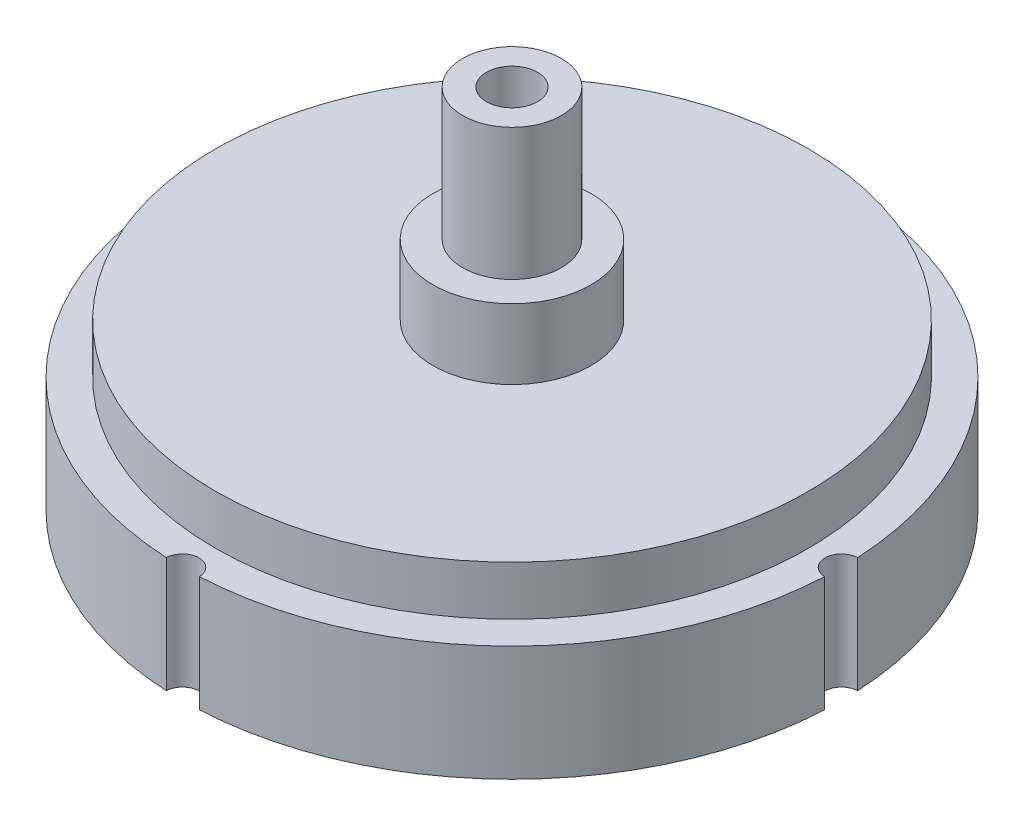
ISO-10303-21;
HEADER;
FILE_DESCRIPTION(('STEP AP214'),'2;1');
FILE_NAME('part.step','',(''),(''),'','','');
FILE_SCHEMA(('AUTOMOTIVE_DESIGN { 1 0 10303 214 1 1 1 1 }'));
ENDSEC;
DATA;
#1=APPLICATION_CONTEXT('core data for automotive mechanical design processes');
#2=APPLICATION_PROTOCOL_DEFINITION('international standard','automotive_design',2000,#1);
#3=PRODUCT_CONTEXT('',#1,'mechanical');
#4=PRODUCT('Part','Part','',(#3));
#5=PRODUCT_RELATED_PRODUCT_CATEGORY('part','',(#4));
#6=PRODUCT_DEFINITION_FORMATION('','',#4);
#7=PRODUCT_DEFINITION_CONTEXT('part definition',#1,'design');
#8=PRODUCT_DEFINITION('design','',#6,#7);
#9=PRODUCT_DEFINITION_SHAPE('','',#8);
#10=(LENGTH_UNIT() NAMED_UNIT(*) SI_UNIT(.MILLI.,.METRE.));
#11=(NAMED_UNIT(*) PLANE_ANGLE_UNIT() SI_UNIT($,.RADIAN.));
#12=(NAMED_UNIT(*) SI_UNIT($,.STERADIAN.) SOLID_ANGLE_UNIT());
#13=UNCERTAINTY_MEASURE_WITH_UNIT(LENGTH_MEASURE(1.E-05),#10,'distance_accuracy_value','');
#14=(GEOMETRIC_REPRESENTATION_CONTEXT(3) GLOBAL_UNCERTAINTY_ASSIGNED_CONTEXT((#13)) GLOBAL_UNIT_ASSIGNED_CONTEXT((#10,
#11,#12)) REPRESENTATION_CONTEXT('',''));
#15=CARTESIAN_POINT('',(0.,0.,0.));
#16=DIRECTION('',(0.,0.,1.));
#17=DIRECTION('',(1.,0.,0.));
#18=AXIS2_PLACEMENT_3D('',#15,#16,#17);
#19=CARTESIAN_POINT('',(0.,0.,0.));
#20=DIRECTION('',(0.,-1.,0.));
#21=DIRECTION('',(0.,0.,-1.));
#22=AXIS2_PLACEMENT_3D('',#19,#20,#21);
#23=CYLINDRICAL_SURFACE('',#22,10.);
#24=CARTESIAN_POINT('',(0.,0.,0.));
#25=DIRECTION('',(0.,-1.,0.));
#26=DIRECTION('',(0.,0.,-1.));
#27=AXIS2_PLACEMENT_3D('',#24,#25,#26);
#28=CIRCLE('',#27,10.);
#29=CARTESIAN_POINT('',(-0.499843725578301,0.,9.9875));
#30=VERTEX_POINT('',#29);
#31=CARTESIAN_POINT('',(-9.9875,0.,0.499843725578313));
#32=VERTEX_POINT('',#31);
#33=EDGE_CURVE('E154',#30,#32,#28,.T.);
#34=ORIENTED_EDGE('',*,*,#33,.F.);
#35=DIRECTION('',(0.,-1.,0.));
#36=VECTOR('',#35,1.);
#37=CARTESIAN_POINT('',(-0.499843725578305,5.562494,9.9875));
#38=LINE('',#37,#36);
#39=CARTESIAN_POINT('',(-0.499843725578312,3.5,9.9875));
#40=VERTEX_POINT('',#39);
#41=EDGE_CURVE('E170',#30,#40,#38,.F.);
#42=ORIENTED_EDGE('',*,*,#41,.T.);
#43=CARTESIAN_POINT('',(0.,3.5,0.));
#44=DIRECTION('',(0.,-1.,0.));
#45=DIRECTION('',(0.,0.,-1.));
#46=AXIS2_PLACEMENT_3D('',#43,#44,#45);
#47=CIRCLE('',#46,10.);
#48=CARTESIAN_POINT('',(-9.9875,3.5,0.499843725578312));
#49=VERTEX_POINT('',#48);
#50=EDGE_CURVE('E136',#40,#49,#47,.T.);
#51=ORIENTED_EDGE('',*,*,#50,.T.);
#52=DIRECTION('',(0.,-1.,0.));
#53=VECTOR('',#52,1.);
#54=CARTESIAN_POINT('',(-9.9875,5.562494,0.499843725578306));
#55=LINE('',#54,#53);
#56=EDGE_CURVE('E70',#49,#32,#55,.T.);
#57=ORIENTED_EDGE('',*,*,#56,.T.);
#58=EDGE_LOOP('',(#34,#42,#51,#57));
#59=FACE_BOUND('',#58,.T.);
#60=ADVANCED_FACE('F46',(#59),#23,.T.);
#61=CARTESIAN_POINT('',(9.9875,3.5,0.499843725578312));
#62=VERTEX_POINT('',#61);
#63=CARTESIAN_POINT('',(0.499843725578312,3.5,9.9875));
#64=VERTEX_POINT('',#63);
#65=EDGE_CURVE('E142',#62,#64,#47,.T.);
#66=ORIENTED_EDGE('',*,*,#65,.T.);
#67=DIRECTION('',(0.,-1.,0.));
#68=VECTOR('',#67,1.);
#69=CARTESIAN_POINT('',(0.499843725578305,5.562494,9.9875));
#70=LINE('',#69,#68);
#71=CARTESIAN_POINT('',(0.499843725578304,0.,9.9875));
#72=VERTEX_POINT('',#71);
#73=EDGE_CURVE('E163',#64,#72,#70,.T.);
#74=ORIENTED_EDGE('',*,*,#73,.T.);
#75=CARTESIAN_POINT('',(9.9875,0.,0.499843725578306));
#76=VERTEX_POINT('',#75);
#77=EDGE_CURVE('E257',#76,#72,#28,.T.);
#78=ORIENTED_EDGE('',*,*,#77,.F.);
#79=DIRECTION('',(0.,-1.,0.));
#80=VECTOR('',#79,1.);
#81=CARTESIAN_POINT('',(9.9875,5.562494,0.499843725578306));
#82=LINE('',#81,#80);
#83=EDGE_CURVE('E165',#76,#62,#82,.F.);
#84=ORIENTED_EDGE('',*,*,#83,.T.);
#85=EDGE_LOOP('',(#66,#74,#78,#84));
#86=FACE_BOUND('',#85,.T.);
#87=ADVANCED_FACE('F161',(#86),#23,.T.);
#88=CARTESIAN_POINT('',(0.499843725578312,3.5,-9.9875));
#89=VERTEX_POINT('',#88);
#90=CARTESIAN_POINT('',(9.9875,3.5,-0.499843725578312));
#91=VERTEX_POINT('',#90);
#92=EDGE_CURVE('E139',#89,#91,#47,.T.);
#93=ORIENTED_EDGE('',*,*,#92,.T.);
#94=DIRECTION('',(0.,-1.,0.));
#95=VECTOR('',#94,1.);
#96=CARTESIAN_POINT('',(9.9875,5.562494,-0.499843725578306));
#97=LINE('',#96,#95);
#98=CARTESIAN_POINT('',(9.9875,0.,-0.499843725578305));
#99=VERTEX_POINT('',#98);
#100=EDGE_CURVE('E277',#91,#99,#97,.T.);
#101=ORIENTED_EDGE('',*,*,#100,.T.);
#102=CARTESIAN_POINT('',(0.499843725578305,0.,-9.9875));
#103=VERTEX_POINT('',#102);
#104=EDGE_CURVE('E155',#103,#99,#28,.T.);
#105=ORIENTED_EDGE('',*,*,#104,.F.);
#106=DIRECTION('',(0.,-1.,0.));
#107=VECTOR('',#106,1.);
#108=CARTESIAN_POINT('',(0.499843725578305,5.562494,-9.9875));
#109=LINE('',#108,#107);
#110=EDGE_CURVE('E268',#103,#89,#109,.F.);
#111=ORIENTED_EDGE('',*,*,#110,.T.);
#112=EDGE_LOOP('',(#93,#101,#105,#111));
#113=FACE_BOUND('',#112,.T.);
#114=ADVANCED_FACE('F234',(#113),#23,.T.);
#115=CARTESIAN_POINT('',(-1.5,11.125,0.));
#116=DIRECTION('',(0.,-1.,0.));
#117=DIRECTION('',(0.,0.,-1.));
#118=AXIS2_PLACEMENT_3D('',#115,#116,#117);
#119=PLANE('',#118);
#120=CARTESIAN_POINT('',(0.,11.125,0.));
#121=DIRECTION('',(0.,-1.,0.));
#122=DIRECTION('',(0.,0.,-1.));
#123=AXIS2_PLACEMENT_3D('',#120,#121,#122);
#124=CIRCLE('',#123,1.5);
#125=CARTESIAN_POINT('',(0.,11.125,-1.5));
#126=VERTEX_POINT('',#125);
#127=EDGE_CURVE('E180',#126,#126,#124,.T.);
#128=ORIENTED_EDGE('',*,*,#127,.F.);
#129=EDGE_LOOP('',(#128));
#130=FACE_BOUND('',#129,.T.);
#131=CARTESIAN_POINT('',(0.,11.125,0.));
#132=DIRECTION('',(0.,-1.,0.));
#133=DIRECTION('',(0.,0.,-1.));
#134=AXIS2_PLACEMENT_3D('',#131,#132,#133);
#135=CIRCLE('',#134,0.775);
#136=CARTESIAN_POINT('',(0.,11.125,-0.775));
#137=VERTEX_POINT('',#136);
#138=EDGE_CURVE('E120',#137,#137,#135,.T.);
#139=ORIENTED_EDGE('',*,*,#138,.T.);
#140=EDGE_LOOP('',(#139));
#141=FACE_BOUND('',#140,.T.);
#142=ADVANCED_FACE('F48',(#130,#141),#119,.F.);
#143=CARTESIAN_POINT('',(0.,0.,0.));
#144=DIRECTION('',(0.,-1.,0.));
#145=DIRECTION('',(0.,0.,-1.));
#146=AXIS2_PLACEMENT_3D('',#143,#144,#145);
#147=CYLINDRICAL_SURFACE('',#146,0.774999999999999);
#148=ORIENTED_EDGE('',*,*,#138,.F.);
#149=EDGE_LOOP('',(#148));
#150=FACE_BOUND('',#149,.T.);
#151=CARTESIAN_POINT('',(0.,4.,0.));
#152=DIRECTION('',(0.,-1.,0.));
#153=DIRECTION('',(0.,0.,-1.));
#154=AXIS2_PLACEMENT_3D('',#151,#152,#153);
#155=CIRCLE('',#154,0.774999999999999);
#156=CARTESIAN_POINT('',(0.,4.,-0.774999999999999));
#157=VERTEX_POINT('',#156);
#158=EDGE_CURVE('E239',#157,#157,#155,.T.);
#159=ORIENTED_EDGE('',*,*,#158,.T.);
#160=EDGE_LOOP('',(#159));
#161=FACE_BOUND('',#160,.T.);
#162=ADVANCED_FACE('F233',(#150,#161),#147,.F.);
#163=CARTESIAN_POINT('',(-1.2,4.,0.));
#164=DIRECTION('',(0.,1.,0.));
#165=DIRECTION('',(0.,0.,1.));
#166=AXIS2_PLACEMENT_3D('',#163,#164,#165);
#167=PLANE('',#166);
#168=ORIENTED_EDGE('',*,*,#158,.F.);
#169=EDGE_LOOP('',(#168));
#170=FACE_BOUND('',#169,.T.);
#171=CARTESIAN_POINT('',(0.,4.,0.));
#172=DIRECTION('',(0.,-1.,0.));
#173=DIRECTION('',(0.,0.,-1.));
#174=AXIS2_PLACEMENT_3D('',#171,#172,#173);
#175=CIRCLE('',#174,1.2);
#176=CARTESIAN_POINT('',(0.,4.,-1.2));
#177=VERTEX_POINT('',#176);
#178=EDGE_CURVE('E243',#177,#177,#175,.T.);
#179=ORIENTED_EDGE('',*,*,#178,.T.);
#180=EDGE_LOOP('',(#179));
#181=FACE_BOUND('',#180,.T.);
#182=ADVANCED_FACE('F405',(#170,#181),#167,.F.);
#183=CARTESIAN_POINT('',(0.,0.,0.));
#184=DIRECTION('',(0.,-1.,0.));
#185=DIRECTION('',(0.,0.,-1.));
#186=AXIS2_PLACEMENT_3D('',#183,#184,#185);
#187=CYLINDRICAL_SURFACE('',#186,1.2);
#188=ORIENTED_EDGE('',*,*,#178,.F.);
#189=EDGE_LOOP('',(#188));
#190=FACE_BOUND('',#189,.T.);
#191=CARTESIAN_POINT('',(0.,0.,0.));
#192=DIRECTION('',(0.,-1.,0.));
#193=DIRECTION('',(0.,0.,-1.));
#194=AXIS2_PLACEMENT_3D('',#191,#192,#193);
#195=CIRCLE('',#194,1.2);
#196=CARTESIAN_POINT('',(0.,0.,-1.2));
#197=VERTEX_POINT('',#196);
#198=EDGE_CURVE('E252',#197,#197,#195,.T.);
#199=ORIENTED_EDGE('',*,*,#198,.T.);
#200=EDGE_LOOP('',(#199));
#201=FACE_BOUND('',#200,.T.);
#202=ADVANCED_FACE('F305',(#190,#201),#187,.F.);
#203=CARTESIAN_POINT('',(-1.2,0.,0.));
#204=DIRECTION('',(0.,1.,0.));
#205=DIRECTION('',(0.,0.,1.));
#206=AXIS2_PLACEMENT_3D('',#203,#204,#205);
#207=PLANE('',#206);
#208=ORIENTED_EDGE('',*,*,#198,.F.);
#209=EDGE_LOOP('',(#208));
#210=FACE_BOUND('',#209,.T.);
#211=ORIENTED_EDGE('',*,*,#77,.T.);
#212=CARTESIAN_POINT('',(0.,0.,10.));
#213=DIRECTION('',(0.,1.,0.));
#214=DIRECTION('',(0.,0.,1.));
#215=AXIS2_PLACEMENT_3D('',#212,#213,#214);
#216=CIRCLE('',#215,0.5);
#217=EDGE_CURVE('E176',#72,#30,#216,.T.);
#218=ORIENTED_EDGE('',*,*,#217,.T.);
#219=ORIENTED_EDGE('',*,*,#33,.T.);
#220=CARTESIAN_POINT('',(-10.,0.,0.));
#221=DIRECTION('',(0.,1.,0.));
#222=DIRECTION('',(0.,0.,1.));
#223=AXIS2_PLACEMENT_3D('',#220,#221,#222);
#224=CIRCLE('',#223,0.500000000000001);
#225=CARTESIAN_POINT('',(-9.9875,0.,-0.499843725578301));
#226=VERTEX_POINT('',#225);
#227=EDGE_CURVE('E130',#32,#226,#224,.T.);
#228=ORIENTED_EDGE('',*,*,#227,.T.);
#229=CARTESIAN_POINT('',(-0.499843725578305,0.,-9.9875));
#230=VERTEX_POINT('',#229);
#231=EDGE_CURVE('E128',#226,#230,#28,.T.);
#232=ORIENTED_EDGE('',*,*,#231,.T.);
#233=CARTESIAN_POINT('',(0.,0.,-10.));
#234=DIRECTION('',(0.,1.,0.));
#235=DIRECTION('',(0.,0.,1.));
#236=AXIS2_PLACEMENT_3D('',#233,#234,#235);
#237=CIRCLE('',#236,0.5);
#238=EDGE_CURVE('E274',#230,#103,#237,.T.);
#239=ORIENTED_EDGE('',*,*,#238,.T.);
#240=ORIENTED_EDGE('',*,*,#104,.T.);
#241=CARTESIAN_POINT('',(10.,0.,0.));
#242=DIRECTION('',(0.,1.,0.));
#243=DIRECTION('',(0.,0.,1.));
#244=AXIS2_PLACEMENT_3D('',#241,#242,#243);
#245=CIRCLE('',#244,0.500000000000001);
#246=EDGE_CURVE('E182',#99,#76,#245,.T.);
#247=ORIENTED_EDGE('',*,*,#246,.T.);
#248=EDGE_LOOP('',(#211,#218,#219,#228,#232,#239,#240,#247));
#249=FACE_BOUND('',#248,.T.);
#250=ADVANCED_FACE('F264',(#210,#249),#207,.F.);
#251=CARTESIAN_POINT('',(-9.9875,3.5,-0.499843725578312));
#252=VERTEX_POINT('',#251);
#253=CARTESIAN_POINT('',(-0.499843725578312,3.5,-9.9875));
#254=VERTEX_POINT('',#253);
#255=EDGE_CURVE('E126',#252,#254,#47,.T.);
#256=ORIENTED_EDGE('',*,*,#255,.T.);
#257=DIRECTION('',(0.,-1.,0.));
#258=VECTOR('',#257,1.);
#259=CARTESIAN_POINT('',(-0.499843725578305,5.562494,-9.9875));
#260=LINE('',#259,#258);
#261=EDGE_CURVE('E62',#254,#230,#260,.T.);
#262=ORIENTED_EDGE('',*,*,#261,.T.);
#263=ORIENTED_EDGE('',*,*,#231,.F.);
#264=DIRECTION('',(0.,-1.,0.));
#265=VECTOR('',#264,1.);
#266=CARTESIAN_POINT('',(-9.9875,5.562494,-0.499843725578306));
#267=LINE('',#266,#265);
#268=EDGE_CURVE('E112',#226,#252,#267,.F.);
#269=ORIENTED_EDGE('',*,*,#268,.T.);
#270=EDGE_LOOP('',(#256,#262,#263,#269));
#271=FACE_BOUND('',#270,.T.);
#272=ADVANCED_FACE('F125',(#271),#23,.T.);
#273=CARTESIAN_POINT('',(-10.,3.5,0.));
#274=DIRECTION('',(0.,-1.,0.));
#275=DIRECTION('',(0.,0.,-1.));
#276=AXIS2_PLACEMENT_3D('',#273,#274,#275);
#277=PLANE('',#276);
#278=ORIENTED_EDGE('',*,*,#50,.F.);
#279=CARTESIAN_POINT('',(0.,3.5,10.));
#280=DIRECTION('',(0.,-1.,0.));
#281=DIRECTION('',(0.,0.,-1.));
#282=AXIS2_PLACEMENT_3D('',#279,#280,#281);
#283=CIRCLE('',#282,0.5);
#284=EDGE_CURVE('E12',#40,#64,#283,.T.);
#285=ORIENTED_EDGE('',*,*,#284,.T.);
#286=ORIENTED_EDGE('',*,*,#65,.F.);
#287=CARTESIAN_POINT('',(10.,3.5,0.));
#288=DIRECTION('',(0.,-1.,0.));
#289=DIRECTION('',(0.,0.,-1.));
#290=AXIS2_PLACEMENT_3D('',#287,#288,#289);
#291=CIRCLE('',#290,0.500000000000001);
#292=EDGE_CURVE('E55',#62,#91,#291,.T.);
#293=ORIENTED_EDGE('',*,*,#292,.T.);
#294=ORIENTED_EDGE('',*,*,#92,.F.);
#295=CARTESIAN_POINT('',(0.,3.5,-10.));
#296=DIRECTION('',(0.,-1.,0.));
#297=DIRECTION('',(0.,0.,-1.));
#298=AXIS2_PLACEMENT_3D('',#295,#296,#297);
#299=CIRCLE('',#298,0.5);
#300=EDGE_CURVE('E119',#89,#254,#299,.T.);
#301=ORIENTED_EDGE('',*,*,#300,.T.);
#302=ORIENTED_EDGE('',*,*,#255,.F.);
#303=CARTESIAN_POINT('',(-10.,3.5,0.));
#304=DIRECTION('',(0.,-1.,0.));
#305=DIRECTION('',(0.,0.,-1.));
#306=AXIS2_PLACEMENT_3D('',#303,#304,#305);
#307=CIRCLE('',#306,0.500000000000001);
#308=EDGE_CURVE('E109',#252,#49,#307,.T.);
#309=ORIENTED_EDGE('',*,*,#308,.T.);
#310=EDGE_LOOP('',(#278,#285,#286,#293,#294,#301,#302,#309));
#311=FACE_BOUND('',#310,.T.);
#312=CARTESIAN_POINT('',(0.,3.5,0.));
#313=DIRECTION('',(0.,-1.,0.));
#314=DIRECTION('',(0.,0.,-1.));
#315=AXIS2_PLACEMENT_3D('',#312,#313,#314);
#316=CIRCLE('',#315,9.);
#317=CARTESIAN_POINT('',(0.,3.5,-9.));
#318=VERTEX_POINT('',#317);
#319=EDGE_CURVE('E137',#318,#318,#316,.T.);
#320=ORIENTED_EDGE('',*,*,#319,.T.);
#321=EDGE_LOOP('',(#320));
#322=FACE_BOUND('',#321,.T.);
#323=ADVANCED_FACE('F132',(#311,#322),#277,.F.);
#324=CARTESIAN_POINT('',(0.,0.,0.));
#325=DIRECTION('',(0.,-1.,0.));
#326=DIRECTION('',(0.,0.,-1.));
#327=AXIS2_PLACEMENT_3D('',#324,#325,#326);
#328=CYLINDRICAL_SURFACE('',#327,9.);
#329=ORIENTED_EDGE('',*,*,#319,.F.);
#330=EDGE_LOOP('',(#329));
#331=FACE_BOUND('',#330,.T.);
#332=CARTESIAN_POINT('',(0.,5.,0.));
#333=DIRECTION('',(0.,-1.,0.));
#334=DIRECTION('',(0.,0.,-1.));
#335=AXIS2_PLACEMENT_3D('',#332,#333,#334);
#336=CIRCLE('',#335,9.);
#337=CARTESIAN_POINT('',(0.,5.,-9.));
#338=VERTEX_POINT('',#337);
#339=EDGE_CURVE('E144',#338,#338,#336,.T.);
#340=ORIENTED_EDGE('',*,*,#339,.T.);
#341=EDGE_LOOP('',(#340));
#342=FACE_BOUND('',#341,.T.);
#343=ADVANCED_FACE('F205',(#331,#342),#328,.T.);
#344=CARTESIAN_POINT('',(-9.,5.,0.));
#345=DIRECTION('',(0.,-1.,0.));
#346=DIRECTION('',(0.,0.,-1.));
#347=AXIS2_PLACEMENT_3D('',#344,#345,#346);
#348=PLANE('',#347);
#349=ORIENTED_EDGE('',*,*,#339,.F.);
#350=EDGE_LOOP('',(#349));
#351=FACE_BOUND('',#350,.T.);
#352=CARTESIAN_POINT('',(0.,5.,0.));
#353=DIRECTION('',(0.,-1.,0.));
#354=DIRECTION('',(0.,0.,-1.));
#355=AXIS2_PLACEMENT_3D('',#352,#353,#354);
#356=CIRCLE('',#355,2.4);
#357=CARTESIAN_POINT('',(0.,5.,-2.4));
#358=VERTEX_POINT('',#357);
#359=EDGE_CURVE('E197',#358,#358,#356,.T.);
#360=ORIENTED_EDGE('',*,*,#359,.T.);
#361=EDGE_LOOP('',(#360));
#362=FACE_BOUND('',#361,.T.);
#363=ADVANCED_FACE('F207',(#351,#362),#348,.F.);
#364=CARTESIAN_POINT('',(0.,0.,0.));
#365=DIRECTION('',(0.,-1.,0.));
#366=DIRECTION('',(0.,0.,-1.));
#367=AXIS2_PLACEMENT_3D('',#364,#365,#366);
#368=CYLINDRICAL_SURFACE('',#367,2.4);
#369=ORIENTED_EDGE('',*,*,#359,.F.);
#370=EDGE_LOOP('',(#369));
#371=FACE_BOUND('',#370,.T.);
#372=CARTESIAN_POINT('',(0.,7.125,0.));
#373=DIRECTION('',(0.,-1.,0.));
#374=DIRECTION('',(0.,0.,-1.));
#375=AXIS2_PLACEMENT_3D('',#372,#373,#374);
#376=CIRCLE('',#375,2.4);
#377=CARTESIAN_POINT('',(0.,7.125,-2.4));
#378=VERTEX_POINT('',#377);
#379=EDGE_CURVE('E193',#378,#378,#376,.T.);
#380=ORIENTED_EDGE('',*,*,#379,.T.);
#381=EDGE_LOOP('',(#380));
#382=FACE_BOUND('',#381,.T.);
#383=ADVANCED_FACE('F210',(#371,#382),#368,.T.);
#384=CARTESIAN_POINT('',(-2.4,7.125,0.));
#385=DIRECTION('',(0.,-1.,0.));
#386=DIRECTION('',(0.,0.,-1.));
#387=AXIS2_PLACEMENT_3D('',#384,#385,#386);
#388=PLANE('',#387);
#389=ORIENTED_EDGE('',*,*,#379,.F.);
#390=EDGE_LOOP('',(#389));
#391=FACE_BOUND('',#390,.T.);
#392=CARTESIAN_POINT('',(0.,7.125,0.));
#393=DIRECTION('',(0.,-1.,0.));
#394=DIRECTION('',(0.,0.,-1.));
#395=AXIS2_PLACEMENT_3D('',#392,#393,#394);
#396=CIRCLE('',#395,1.5);
#397=CARTESIAN_POINT('',(0.,7.125,-1.5));
#398=VERTEX_POINT('',#397);
#399=EDGE_CURVE('E189',#398,#398,#396,.T.);
#400=ORIENTED_EDGE('',*,*,#399,.T.);
#401=EDGE_LOOP('',(#400));
#402=FACE_BOUND('',#401,.T.);
#403=ADVANCED_FACE('F216',(#391,#402),#388,.F.);
#404=CARTESIAN_POINT('',(0.,0.,0.));
#405=DIRECTION('',(0.,-1.,0.));
#406=DIRECTION('',(0.,0.,-1.));
#407=AXIS2_PLACEMENT_3D('',#404,#405,#406);
#408=CYLINDRICAL_SURFACE('',#407,1.5);
#409=ORIENTED_EDGE('',*,*,#399,.F.);
#410=EDGE_LOOP('',(#409));
#411=FACE_BOUND('',#410,.T.);
#412=ORIENTED_EDGE('',*,*,#127,.T.);
#413=EDGE_LOOP('',(#412));
#414=FACE_BOUND('',#413,.T.);
#415=ADVANCED_FACE('F222',(#411,#414),#408,.T.);
#416=CARTESIAN_POINT('',(-10.,11.125,0.));
#417=DIRECTION('',(0.,-1.,0.));
#418=DIRECTION('',(0.,0.,-1.));
#419=AXIS2_PLACEMENT_3D('',#416,#417,#418);
#420=CYLINDRICAL_SURFACE('',#419,0.500000000000001);
#421=ORIENTED_EDGE('',*,*,#56,.F.);
#422=ORIENTED_EDGE('',*,*,#308,.F.);
#423=ORIENTED_EDGE('',*,*,#268,.F.);
#424=ORIENTED_EDGE('',*,*,#227,.F.);
#425=EDGE_LOOP('',(#421,#422,#423,#424));
#426=FACE_BOUND('',#425,.T.);
#427=ADVANCED_FACE('F111',(#426),#420,.F.);
#428=CARTESIAN_POINT('',(0.,11.125,-10.));
#429=DIRECTION('',(0.,-1.,0.));
#430=DIRECTION('',(0.,0.,-1.));
#431=AXIS2_PLACEMENT_3D('',#428,#429,#430);
#432=CYLINDRICAL_SURFACE('',#431,0.5);
#433=ORIENTED_EDGE('',*,*,#261,.F.);
#434=ORIENTED_EDGE('',*,*,#300,.F.);
#435=ORIENTED_EDGE('',*,*,#110,.F.);
#436=ORIENTED_EDGE('',*,*,#238,.F.);
#437=EDGE_LOOP('',(#433,#434,#435,#436));
#438=FACE_BOUND('',#437,.T.);
#439=ADVANCED_FACE('F284',(#438),#432,.F.);
#440=CARTESIAN_POINT('',(10.,11.125,0.));
#441=DIRECTION('',(0.,-1.,0.));
#442=DIRECTION('',(0.,0.,-1.));
#443=AXIS2_PLACEMENT_3D('',#440,#441,#442);
#444=CYLINDRICAL_SURFACE('',#443,0.500000000000001);
#445=ORIENTED_EDGE('',*,*,#100,.F.);
#446=ORIENTED_EDGE('',*,*,#292,.F.);
#447=ORIENTED_EDGE('',*,*,#83,.F.);
#448=ORIENTED_EDGE('',*,*,#246,.F.);
#449=EDGE_LOOP('',(#445,#446,#447,#448));
#450=FACE_BOUND('',#449,.T.);
#451=ADVANCED_FACE('F283',(#450),#444,.F.);
#452=CARTESIAN_POINT('',(0.,11.125,10.));
#453=DIRECTION('',(0.,-1.,0.));
#454=DIRECTION('',(0.,0.,-1.));
#455=AXIS2_PLACEMENT_3D('',#452,#453,#454);
#456=CYLINDRICAL_SURFACE('',#455,0.5);
#457=ORIENTED_EDGE('',*,*,#73,.F.);
#458=ORIENTED_EDGE('',*,*,#284,.F.);
#459=ORIENTED_EDGE('',*,*,#41,.F.);
#460=ORIENTED_EDGE('',*,*,#217,.F.);
#461=EDGE_LOOP('',(#457,#458,#459,#460));
#462=FACE_BOUND('',#461,.T.);
#463=ADVANCED_FACE('F169',(#462),#456,.F.);
#464=CLOSED_SHELL('',(#60,#87,#114,#142,#162,#182,#202,#250,#272,#323,#343,#363,#383,#403,#415,
#427,#439,#451,#463));
#465=MANIFOLD_SOLID_BREP('B2',#464);
#466=ADVANCED_BREP_SHAPE_REPRESENTATION('',(#18,#465),#14);
#467=SHAPE_DEFINITION_REPRESENTATION(#9,#466);
ENDSEC;
END-ISO-10303-21;
